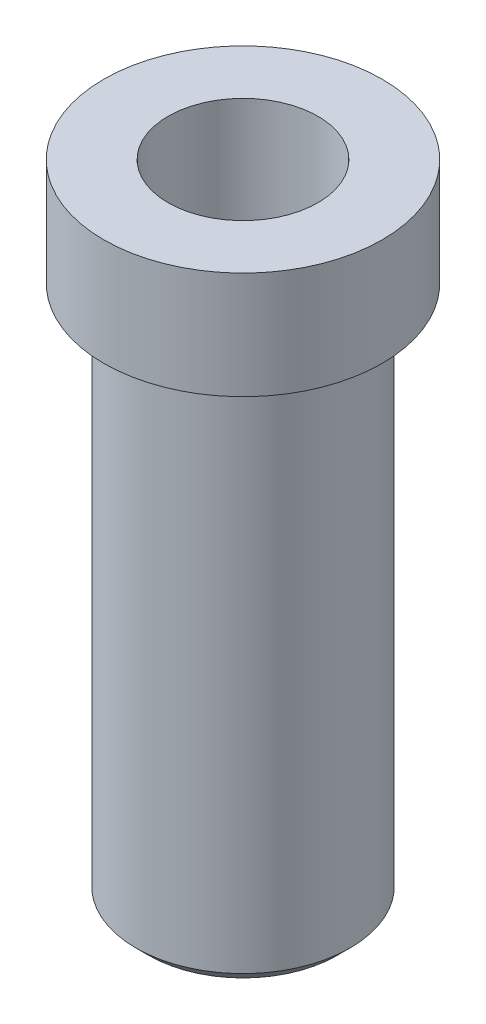
ISO-10303-21;
HEADER;
FILE_DESCRIPTION(('STEP AP214'),'2;1');
FILE_NAME('part.step','',(''),(''),'','','');
FILE_SCHEMA(('AUTOMOTIVE_DESIGN { 1 0 10303 214 1 1 1 1 }'));
ENDSEC;
DATA;
#1=APPLICATION_CONTEXT('core data for automotive mechanical design processes');
#2=APPLICATION_PROTOCOL_DEFINITION('international standard','automotive_design',2000,#1);
#3=PRODUCT_CONTEXT('',#1,'mechanical');
#4=PRODUCT('Part','Part','',(#3));
#5=PRODUCT_RELATED_PRODUCT_CATEGORY('part','',(#4));
#6=PRODUCT_DEFINITION_FORMATION('','',#4);
#7=PRODUCT_DEFINITION_CONTEXT('part definition',#1,'design');
#8=PRODUCT_DEFINITION('design','',#6,#7);
#9=PRODUCT_DEFINITION_SHAPE('','',#8);
#10=(LENGTH_UNIT() NAMED_UNIT(*) SI_UNIT(.MILLI.,.METRE.));
#11=(NAMED_UNIT(*) PLANE_ANGLE_UNIT() SI_UNIT($,.RADIAN.));
#12=(NAMED_UNIT(*) SI_UNIT($,.STERADIAN.) SOLID_ANGLE_UNIT());
#13=UNCERTAINTY_MEASURE_WITH_UNIT(LENGTH_MEASURE(1.E-05),#10,'distance_accuracy_value','');
#14=(GEOMETRIC_REPRESENTATION_CONTEXT(3) GLOBAL_UNCERTAINTY_ASSIGNED_CONTEXT((#13)) GLOBAL_UNIT_ASSIGNED_CONTEXT((#10,
#11,#12)) REPRESENTATION_CONTEXT('',''));
#15=CARTESIAN_POINT('',(0.,0.,0.));
#16=DIRECTION('',(0.,0.,1.));
#17=DIRECTION('',(1.,0.,0.));
#18=AXIS2_PLACEMENT_3D('',#15,#16,#17);
#19=CARTESIAN_POINT('',(0.,1.5298060599207,0.));
#20=DIRECTION('',(0.,1.,0.));
#21=DIRECTION('',(0.,0.,1.));
#22=AXIS2_PLACEMENT_3D('',#19,#20,#21);
#23=CYLINDRICAL_SURFACE('',#22,0.65);
#24=CARTESIAN_POINT('',(0.,1.5298060599207,0.));
#25=DIRECTION('',(0.,1.,0.));
#26=DIRECTION('',(0.,0.,1.));
#27=AXIS2_PLACEMENT_3D('',#24,#25,#26);
#28=CIRCLE('',#27,0.65);
#29=CARTESIAN_POINT('',(0.,1.5298060599207,0.65));
#30=VERTEX_POINT('',#29);
#31=EDGE_CURVE('E49',#30,#30,#28,.T.);
#32=ORIENTED_EDGE('',*,*,#31,.F.);
#33=EDGE_LOOP('',(#32));
#34=FACE_BOUND('',#33,.T.);
#35=CARTESIAN_POINT('',(0.,1.0298060599207,0.));
#36=DIRECTION('',(0.,1.,0.));
#37=DIRECTION('',(0.,0.,1.));
#38=AXIS2_PLACEMENT_3D('',#35,#36,#37);
#39=CIRCLE('',#38,0.65);
#40=CARTESIAN_POINT('',(0.,1.0298060599207,0.65));
#41=VERTEX_POINT('',#40);
#42=EDGE_CURVE('E64',#41,#41,#39,.T.);
#43=ORIENTED_EDGE('',*,*,#42,.T.);
#44=EDGE_LOOP('',(#43));
#45=FACE_BOUND('',#44,.T.);
#46=ADVANCED_FACE('F37',(#34,#45),#23,.T.);
#47=CARTESIAN_POINT('',(0.65,1.5298060599207,0.));
#48=DIRECTION('',(0.,-1.,0.));
#49=DIRECTION('',(0.,0.,-1.));
#50=AXIS2_PLACEMENT_3D('',#47,#48,#49);
#51=PLANE('',#50);
#52=CARTESIAN_POINT('',(0.,1.5298060599207,0.));
#53=DIRECTION('',(0.,1.,0.));
#54=DIRECTION('',(0.,0.,1.));
#55=AXIS2_PLACEMENT_3D('',#52,#53,#54);
#56=CIRCLE('',#55,0.35);
#57=CARTESIAN_POINT('',(0.,1.5298060599207,0.35));
#58=VERTEX_POINT('',#57);
#59=EDGE_CURVE('E53',#58,#58,#56,.T.);
#60=ORIENTED_EDGE('',*,*,#59,.F.);
#61=EDGE_LOOP('',(#60));
#62=FACE_BOUND('',#61,.T.);
#63=ORIENTED_EDGE('',*,*,#31,.T.);
#64=EDGE_LOOP('',(#63));
#65=FACE_BOUND('',#64,.T.);
#66=ADVANCED_FACE('F85',(#62,#65),#51,.F.);
#67=CARTESIAN_POINT('',(0.,1.5298060599207,0.));
#68=DIRECTION('',(0.,1.,0.));
#69=DIRECTION('',(0.,0.,1.));
#70=AXIS2_PLACEMENT_3D('',#67,#68,#69);
#71=CYLINDRICAL_SURFACE('',#70,0.35);
#72=CARTESIAN_POINT('',(0.,-1.4701939400793,0.));
#73=DIRECTION('',(0.,1.,0.));
#74=DIRECTION('',(0.,0.,1.));
#75=AXIS2_PLACEMENT_3D('',#72,#73,#74);
#76=CIRCLE('',#75,0.35);
#77=CARTESIAN_POINT('',(0.,-1.4701939400793,0.35));
#78=VERTEX_POINT('',#77);
#79=EDGE_CURVE('E58',#78,#78,#76,.T.);
#80=ORIENTED_EDGE('',*,*,#79,.F.);
#81=EDGE_LOOP('',(#80));
#82=FACE_BOUND('',#81,.T.);
#83=ORIENTED_EDGE('',*,*,#59,.T.);
#84=EDGE_LOOP('',(#83));
#85=FACE_BOUND('',#84,.T.);
#86=ADVANCED_FACE('F82',(#82,#85),#71,.F.);
#87=CARTESIAN_POINT('',(0.35,-1.4701939400793,0.));
#88=DIRECTION('',(0.,1.,0.));
#89=DIRECTION('',(0.,0.,1.));
#90=AXIS2_PLACEMENT_3D('',#87,#88,#89);
#91=PLANE('',#90);
#92=CARTESIAN_POINT('',(0.,-1.4701939400793,0.));
#93=DIRECTION('',(0.,1.,0.));
#94=DIRECTION('',(0.,0.,1.));
#95=AXIS2_PLACEMENT_3D('',#92,#93,#94);
#96=CIRCLE('',#95,0.44);
#97=CARTESIAN_POINT('',(0.,-1.4701939400793,0.44));
#98=VERTEX_POINT('',#97);
#99=EDGE_CURVE('E10',#98,#98,#96,.F.);
#100=ORIENTED_EDGE('',*,*,#99,.T.);
#101=EDGE_LOOP('',(#100));
#102=FACE_BOUND('',#101,.T.);
#103=ORIENTED_EDGE('',*,*,#79,.T.);
#104=EDGE_LOOP('',(#103));
#105=FACE_BOUND('',#104,.T.);
#106=ADVANCED_FACE('F77',(#102,#105),#91,.F.);
#107=CARTESIAN_POINT('',(0.,1.5298060599207,0.));
#108=DIRECTION('',(0.,1.,0.));
#109=DIRECTION('',(0.,0.,1.));
#110=AXIS2_PLACEMENT_3D('',#107,#108,#109);
#111=CYLINDRICAL_SURFACE('',#110,0.5);
#112=CARTESIAN_POINT('',(0.,-1.4101939400793,0.));
#113=DIRECTION('',(0.,1.,0.));
#114=DIRECTION('',(0.,0.,1.));
#115=AXIS2_PLACEMENT_3D('',#112,#113,#114);
#116=CIRCLE('',#115,0.5);
#117=CARTESIAN_POINT('',(0.,-1.4101939400793,0.5));
#118=VERTEX_POINT('',#117);
#119=EDGE_CURVE('E45',#118,#118,#116,.T.);
#120=ORIENTED_EDGE('',*,*,#119,.T.);
#121=EDGE_LOOP('',(#120));
#122=FACE_BOUND('',#121,.T.);
#123=CARTESIAN_POINT('',(0.,1.0298060599207,0.));
#124=DIRECTION('',(0.,1.,0.));
#125=DIRECTION('',(0.,0.,1.));
#126=AXIS2_PLACEMENT_3D('',#123,#124,#125);
#127=CIRCLE('',#126,0.5);
#128=CARTESIAN_POINT('',(0.,1.0298060599207,0.5));
#129=VERTEX_POINT('',#128);
#130=EDGE_CURVE('E61',#129,#129,#127,.T.);
#131=ORIENTED_EDGE('',*,*,#130,.F.);
#132=EDGE_LOOP('',(#131));
#133=FACE_BOUND('',#132,.T.);
#134=ADVANCED_FACE('F72',(#122,#133),#111,.T.);
#135=CARTESIAN_POINT('',(0.5,1.0298060599207,0.));
#136=DIRECTION('',(0.,1.,0.));
#137=DIRECTION('',(0.,0.,1.));
#138=AXIS2_PLACEMENT_3D('',#135,#136,#137);
#139=PLANE('',#138);
#140=ORIENTED_EDGE('',*,*,#42,.F.);
#141=EDGE_LOOP('',(#140));
#142=FACE_BOUND('',#141,.T.);
#143=ORIENTED_EDGE('',*,*,#130,.T.);
#144=EDGE_LOOP('',(#143));
#145=FACE_BOUND('',#144,.T.);
#146=ADVANCED_FACE('F69',(#142,#145),#139,.F.);
#147=CARTESIAN_POINT('',(0.,-1.4101939400793,0.));
#148=DIRECTION('',(0.,1.,0.));
#149=DIRECTION('',(0.,0.,1.));
#150=AXIS2_PLACEMENT_3D('',#147,#148,#149);
#151=CONICAL_SURFACE('',#150,0.5,0.785398163397448);
#152=ORIENTED_EDGE('',*,*,#99,.F.);
#153=EDGE_LOOP('',(#152));
#154=FACE_BOUND('',#153,.T.);
#155=ORIENTED_EDGE('',*,*,#119,.F.);
#156=EDGE_LOOP('',(#155));
#157=FACE_BOUND('',#156,.T.);
#158=ADVANCED_FACE('F40',(#154,#157),#151,.T.);
#159=CLOSED_SHELL('',(#46,#66,#86,#106,#134,#146,#158));
#160=MANIFOLD_SOLID_BREP('B2',#159);
#161=ADVANCED_BREP_SHAPE_REPRESENTATION('',(#18,#160),#14);
#162=SHAPE_DEFINITION_REPRESENTATION(#9,#161);
ENDSEC;
END-ISO-10303-21;
